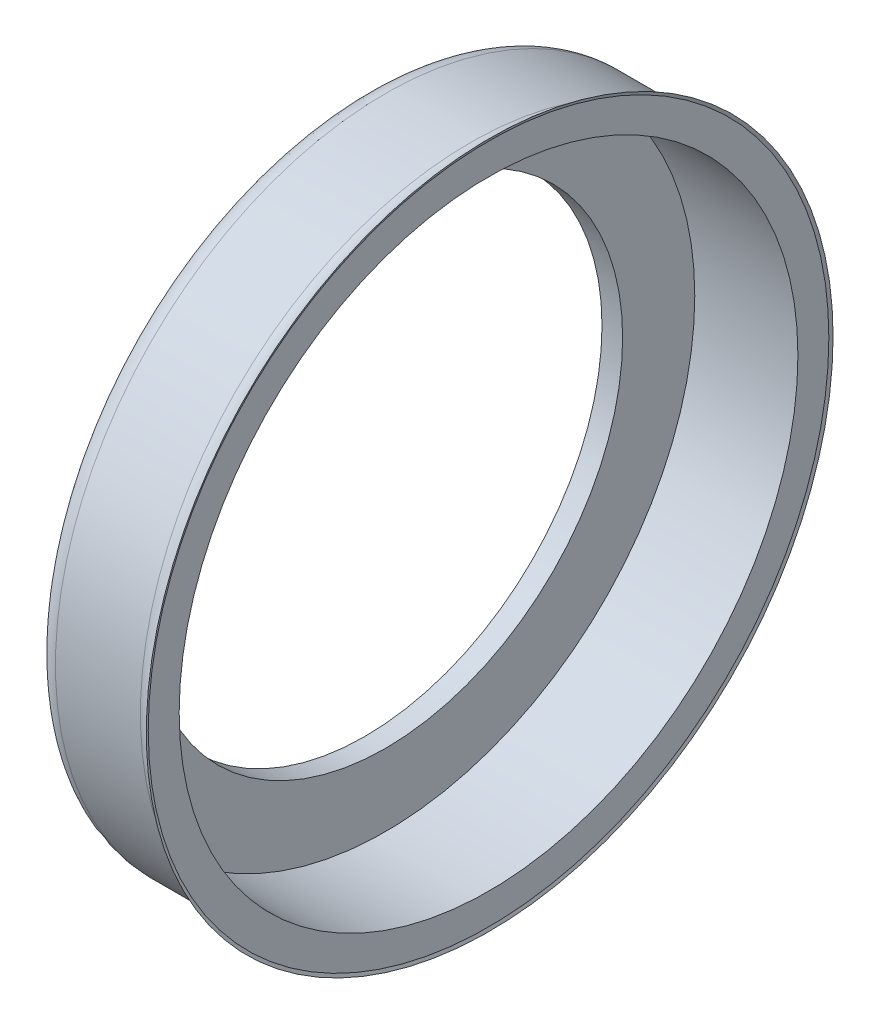
ISO-10303-21;
HEADER;
FILE_DESCRIPTION(('STEP AP214'),'2;1');
FILE_NAME('part.step','',(''),(''),'','','');
FILE_SCHEMA(('AUTOMOTIVE_DESIGN { 1 0 10303 214 1 1 1 1 }'));
ENDSEC;
DATA;
#1=APPLICATION_CONTEXT('core data for automotive mechanical design processes');
#2=APPLICATION_PROTOCOL_DEFINITION('international standard','automotive_design',2000,#1);
#3=PRODUCT_CONTEXT('',#1,'mechanical');
#4=PRODUCT('Part','Part','',(#3));
#5=PRODUCT_RELATED_PRODUCT_CATEGORY('part','',(#4));
#6=PRODUCT_DEFINITION_FORMATION('','',#4);
#7=PRODUCT_DEFINITION_CONTEXT('part definition',#1,'design');
#8=PRODUCT_DEFINITION('design','',#6,#7);
#9=PRODUCT_DEFINITION_SHAPE('','',#8);
#10=(LENGTH_UNIT() NAMED_UNIT(*) SI_UNIT(.MILLI.,.METRE.));
#11=(NAMED_UNIT(*) PLANE_ANGLE_UNIT() SI_UNIT($,.RADIAN.));
#12=(NAMED_UNIT(*) SI_UNIT($,.STERADIAN.) SOLID_ANGLE_UNIT());
#13=UNCERTAINTY_MEASURE_WITH_UNIT(LENGTH_MEASURE(1.E-05),#10,'distance_accuracy_value','');
#14=(GEOMETRIC_REPRESENTATION_CONTEXT(3) GLOBAL_UNCERTAINTY_ASSIGNED_CONTEXT((#13)) GLOBAL_UNIT_ASSIGNED_CONTEXT((#10,
#11,#12)) REPRESENTATION_CONTEXT('',''));
#15=CARTESIAN_POINT('',(0.,0.,0.));
#16=DIRECTION('',(0.,0.,1.));
#17=DIRECTION('',(1.,0.,0.));
#18=AXIS2_PLACEMENT_3D('',#15,#16,#17);
#19=CARTESIAN_POINT('',(0.,0.,-15.));
#20=DIRECTION('',(1.,0.,0.));
#21=DIRECTION('',(0.,0.,-1.));
#22=AXIS2_PLACEMENT_3D('',#19,#20,#21);
#23=PLANE('',#22);
#24=CARTESIAN_POINT('',(0.,0.,0.));
#25=DIRECTION('',(1.,0.,0.));
#26=DIRECTION('',(0.,0.,-1.));
#27=AXIS2_PLACEMENT_3D('',#24,#25,#26);
#28=CIRCLE('',#27,16.5);
#29=CARTESIAN_POINT('',(0.,0.,-16.5));
#30=VERTEX_POINT('',#29);
#31=EDGE_CURVE('E63',#30,#30,#28,.T.);
#32=ORIENTED_EDGE('',*,*,#31,.T.);
#33=EDGE_LOOP('',(#32));
#34=FACE_BOUND('',#33,.T.);
#35=CARTESIAN_POINT('',(0.,0.,0.));
#36=DIRECTION('',(1.,0.,0.));
#37=DIRECTION('',(0.,0.,-1.));
#38=AXIS2_PLACEMENT_3D('',#35,#36,#37);
#39=CIRCLE('',#38,15.);
#40=CARTESIAN_POINT('',(0.,0.,-15.));
#41=VERTEX_POINT('',#40);
#42=EDGE_CURVE('E10',#41,#41,#39,.T.);
#43=ORIENTED_EDGE('',*,*,#42,.F.);
#44=EDGE_LOOP('',(#43));
#45=FACE_BOUND('',#44,.T.);
#46=ADVANCED_FACE('F32',(#34,#45),#23,.T.);
#47=CARTESIAN_POINT('',(0.,0.,0.));
#48=DIRECTION('',(1.,0.,0.));
#49=DIRECTION('',(0.,0.,-1.));
#50=AXIS2_PLACEMENT_3D('',#47,#48,#49);
#51=CYLINDRICAL_SURFACE('',#50,15.);
#52=ORIENTED_EDGE('',*,*,#42,.T.);
#53=EDGE_LOOP('',(#52));
#54=FACE_BOUND('',#53,.T.);
#55=CARTESIAN_POINT('',(-5.,0.,0.));
#56=DIRECTION('',(1.,0.,0.));
#57=DIRECTION('',(0.,0.,-1.));
#58=AXIS2_PLACEMENT_3D('',#55,#56,#57);
#59=CIRCLE('',#58,15.);
#60=CARTESIAN_POINT('',(-5.,0.,-15.));
#61=VERTEX_POINT('',#60);
#62=EDGE_CURVE('E38',#61,#61,#59,.T.);
#63=ORIENTED_EDGE('',*,*,#62,.F.);
#64=EDGE_LOOP('',(#63));
#65=FACE_BOUND('',#64,.T.);
#66=ADVANCED_FACE('F81',(#54,#65),#51,.F.);
#67=CARTESIAN_POINT('',(-5.,0.,-11.50146596));
#68=DIRECTION('',(1.,0.,0.));
#69=DIRECTION('',(0.,0.,-1.));
#70=AXIS2_PLACEMENT_3D('',#67,#68,#69);
#71=PLANE('',#70);
#72=ORIENTED_EDGE('',*,*,#62,.T.);
#73=EDGE_LOOP('',(#72));
#74=FACE_BOUND('',#73,.T.);
#75=CARTESIAN_POINT('',(-5.,0.,0.));
#76=DIRECTION('',(1.,0.,0.));
#77=DIRECTION('',(0.,0.,-1.));
#78=AXIS2_PLACEMENT_3D('',#75,#76,#77);
#79=CIRCLE('',#78,11.50146596);
#80=CARTESIAN_POINT('',(-5.,0.,-11.50146596));
#81=VERTEX_POINT('',#80);
#82=EDGE_CURVE('E42',#81,#81,#79,.T.);
#83=ORIENTED_EDGE('',*,*,#82,.F.);
#84=EDGE_LOOP('',(#83));
#85=FACE_BOUND('',#84,.T.);
#86=ADVANCED_FACE('F85',(#74,#85),#71,.T.);
#87=CARTESIAN_POINT('',(0.,0.,0.));
#88=DIRECTION('',(1.,0.,0.));
#89=DIRECTION('',(0.,0.,-1.));
#90=AXIS2_PLACEMENT_3D('',#87,#88,#89);
#91=CYLINDRICAL_SURFACE('',#90,11.50146596);
#92=ORIENTED_EDGE('',*,*,#82,.T.);
#93=EDGE_LOOP('',(#92));
#94=FACE_BOUND('',#93,.T.);
#95=CARTESIAN_POINT('',(-6.,0.,0.));
#96=DIRECTION('',(1.,0.,0.));
#97=DIRECTION('',(0.,0.,-1.));
#98=AXIS2_PLACEMENT_3D('',#95,#96,#97);
#99=CIRCLE('',#98,11.50146596);
#100=CARTESIAN_POINT('',(-6.,0.,-11.50146596));
#101=VERTEX_POINT('',#100);
#102=EDGE_CURVE('E46',#101,#101,#99,.T.);
#103=ORIENTED_EDGE('',*,*,#102,.F.);
#104=EDGE_LOOP('',(#103));
#105=FACE_BOUND('',#104,.T.);
#106=ADVANCED_FACE('F89',(#94,#105),#91,.F.);
#107=CARTESIAN_POINT('',(-6.,0.,-15.));
#108=DIRECTION('',(-1.,0.,0.));
#109=DIRECTION('',(0.,0.,1.));
#110=AXIS2_PLACEMENT_3D('',#107,#108,#109);
#111=PLANE('',#110);
#112=ORIENTED_EDGE('',*,*,#102,.T.);
#113=EDGE_LOOP('',(#112));
#114=FACE_BOUND('',#113,.T.);
#115=CARTESIAN_POINT('',(-6.,0.,0.));
#116=DIRECTION('',(1.,0.,0.));
#117=DIRECTION('',(0.,0.,-1.));
#118=AXIS2_PLACEMENT_3D('',#115,#116,#117);
#119=CIRCLE('',#118,15.);
#120=CARTESIAN_POINT('',(-6.,0.,-15.));
#121=VERTEX_POINT('',#120);
#122=EDGE_CURVE('E51',#121,#121,#119,.T.);
#123=ORIENTED_EDGE('',*,*,#122,.F.);
#124=EDGE_LOOP('',(#123));
#125=FACE_BOUND('',#124,.T.);
#126=ADVANCED_FACE('F95',(#114,#125),#111,.T.);
#127=CARTESIAN_POINT('',(-5.,0.,0.));
#128=DIRECTION('',(1.,0.,0.));
#129=DIRECTION('',(0.,0.,-1.));
#130=AXIS2_PLACEMENT_3D('',#127,#128,#129);
#131=TOROIDAL_SURFACE('',#130,15.,1.);
#132=ORIENTED_EDGE('',*,*,#122,.T.);
#133=EDGE_LOOP('',(#132));
#134=FACE_BOUND('',#133,.T.);
#135=CARTESIAN_POINT('',(-5.,0.,0.));
#136=DIRECTION('',(1.,0.,0.));
#137=DIRECTION('',(0.,0.,-1.));
#138=AXIS2_PLACEMENT_3D('',#135,#136,#137);
#139=CIRCLE('',#138,16.);
#140=CARTESIAN_POINT('',(-5.,0.,-16.));
#141=VERTEX_POINT('',#140);
#142=EDGE_CURVE('E54',#141,#141,#139,.T.);
#143=ORIENTED_EDGE('',*,*,#142,.F.);
#144=EDGE_LOOP('',(#143));
#145=FACE_BOUND('',#144,.T.);
#146=ADVANCED_FACE('F99',(#134,#145),#131,.T.);
#147=CARTESIAN_POINT('',(0.,0.,0.));
#148=DIRECTION('',(1.,0.,0.));
#149=DIRECTION('',(0.,0.,-1.));
#150=AXIS2_PLACEMENT_3D('',#147,#148,#149);
#151=CYLINDRICAL_SURFACE('',#150,16.);
#152=ORIENTED_EDGE('',*,*,#142,.T.);
#153=EDGE_LOOP('',(#152));
#154=FACE_BOUND('',#153,.T.);
#155=CARTESIAN_POINT('',(-0.880539390193938,0.,0.));
#156=DIRECTION('',(1.,0.,0.));
#157=DIRECTION('',(0.,0.,-1.));
#158=AXIS2_PLACEMENT_3D('',#155,#156,#157);
#159=CIRCLE('',#158,16.);
#160=CARTESIAN_POINT('',(-0.880539390193938,0.,-16.));
#161=VERTEX_POINT('',#160);
#162=EDGE_CURVE('E57',#161,#161,#159,.T.);
#163=ORIENTED_EDGE('',*,*,#162,.F.);
#164=EDGE_LOOP('',(#163));
#165=FACE_BOUND('',#164,.T.);
#166=ADVANCED_FACE('F77',(#154,#165),#151,.T.);
#167=CARTESIAN_POINT('',(-0.880539390193938,0.,0.));
#168=DIRECTION('',(1.,0.,0.));
#169=DIRECTION('',(0.,0.,-1.));
#170=AXIS2_PLACEMENT_3D('',#167,#168,#169);
#171=TOROIDAL_SURFACE('',#170,17.,1.);
#172=ORIENTED_EDGE('',*,*,#162,.T.);
#173=EDGE_LOOP('',(#172));
#174=FACE_BOUND('',#173,.T.);
#175=CARTESIAN_POINT('',(0.0558701914404321,0.,0.));
#176=DIRECTION('',(1.,0.,0.));
#177=DIRECTION('',(0.,0.,-1.));
#178=AXIS2_PLACEMENT_3D('',#175,#176,#177);
#179=CIRCLE('',#178,16.6490910439682);
#180=CARTESIAN_POINT('',(0.0558701914404321,0.,-16.6490910439682));
#181=VERTEX_POINT('',#180);
#182=EDGE_CURVE('E60',#181,#181,#179,.T.);
#183=ORIENTED_EDGE('',*,*,#182,.F.);
#184=EDGE_LOOP('',(#183));
#185=FACE_BOUND('',#184,.T.);
#186=ADVANCED_FACE('F71',(#174,#185),#171,.F.);
#187=CARTESIAN_POINT('',(0.,0.,0.));
#188=DIRECTION('',(1.,0.,0.));
#189=DIRECTION('',(0.,0.,-1.));
#190=AXIS2_PLACEMENT_3D('',#187,#188,#189);
#191=CONICAL_SURFACE('',#190,16.5,1.21225471736324);
#192=ORIENTED_EDGE('',*,*,#182,.T.);
#193=EDGE_LOOP('',(#192));
#194=FACE_BOUND('',#193,.T.);
#195=ORIENTED_EDGE('',*,*,#31,.F.);
#196=EDGE_LOOP('',(#195));
#197=FACE_BOUND('',#196,.T.);
#198=ADVANCED_FACE('F69',(#194,#197),#191,.F.);
#199=CLOSED_SHELL('',(#46,#66,#86,#106,#126,#146,#166,#186,#198));
#200=MANIFOLD_SOLID_BREP('B2',#199);
#201=ADVANCED_BREP_SHAPE_REPRESENTATION('',(#18,#200),#14);
#202=SHAPE_DEFINITION_REPRESENTATION(#9,#201);
ENDSEC;
END-ISO-10303-21;
